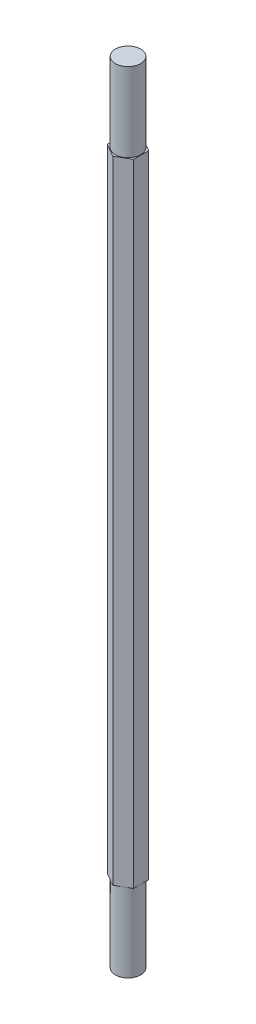
ISO-10303-21;
HEADER;
FILE_DESCRIPTION(('STEP AP214'),'2;1');
FILE_NAME('part.step','',(''),(''),'','','');
FILE_SCHEMA(('AUTOMOTIVE_DESIGN { 1 0 10303 214 1 1 1 1 }'));
ENDSEC;
DATA;
#1=APPLICATION_CONTEXT('core data for automotive mechanical design processes');
#2=APPLICATION_PROTOCOL_DEFINITION('international standard','automotive_design',2000,#1);
#3=PRODUCT_CONTEXT('',#1,'mechanical');
#4=PRODUCT('Part','Part','',(#3));
#5=PRODUCT_RELATED_PRODUCT_CATEGORY('part','',(#4));
#6=PRODUCT_DEFINITION_FORMATION('','',#4);
#7=PRODUCT_DEFINITION_CONTEXT('part definition',#1,'design');
#8=PRODUCT_DEFINITION('design','',#6,#7);
#9=PRODUCT_DEFINITION_SHAPE('','',#8);
#10=(LENGTH_UNIT() NAMED_UNIT(*) SI_UNIT(.MILLI.,.METRE.));
#11=(NAMED_UNIT(*) PLANE_ANGLE_UNIT() SI_UNIT($,.RADIAN.));
#12=(NAMED_UNIT(*) SI_UNIT($,.STERADIAN.) SOLID_ANGLE_UNIT());
#13=UNCERTAINTY_MEASURE_WITH_UNIT(LENGTH_MEASURE(1.E-05),#10,'distance_accuracy_value','');
#14=(GEOMETRIC_REPRESENTATION_CONTEXT(3) GLOBAL_UNCERTAINTY_ASSIGNED_CONTEXT((#13)) GLOBAL_UNIT_ASSIGNED_CONTEXT((#10,
#11,#12)) REPRESENTATION_CONTEXT('',''));
#15=CARTESIAN_POINT('',(0.,0.,0.));
#16=DIRECTION('',(0.,0.,1.));
#17=DIRECTION('',(1.,0.,0.));
#18=AXIS2_PLACEMENT_3D('',#15,#16,#17);
#19=CARTESIAN_POINT('',(0.14076501932061,190.5,-1.06306101828332));
#20=DIRECTION('',(0.499122205111676,0.,0.86653160609666));
#21=DIRECTION('',(0.86653160609666,0.,-0.499122205111676));
#22=AXIS2_PLACEMENT_3D('',#19,#20,#21);
#23=PLANE('',#22);
#24=DIRECTION('',(0.86653160609666,0.,-0.499122205111676));
#25=VECTOR('',#24,1.);
#26=CARTESIAN_POINT('',(0.14076501932061,19.05,-1.06306101828332));
#27=LINE('',#26,#25);
#28=CARTESIAN_POINT('',(-3.02866098313853,19.05,0.762528359133148));
#29=VERTEX_POINT('',#28);
#30=CARTESIAN_POINT('',(0.14076501932061,19.05,-1.06306101828332));
#31=VERTEX_POINT('',#30);
#32=EDGE_CURVE('E48',#29,#31,#27,.T.);
#33=ORIENTED_EDGE('',*,*,#32,.F.);
#34=DIRECTION('',(0.,-1.,0.));
#35=VECTOR('',#34,1.);
#36=CARTESIAN_POINT('',(-3.02866098313853,190.5,0.762528359133148));
#37=LINE('',#36,#35);
#38=CARTESIAN_POINT('',(-3.02866098313853,171.45,0.762528359133148));
#39=VERTEX_POINT('',#38);
#40=EDGE_CURVE('E115',#39,#29,#37,.T.);
#41=ORIENTED_EDGE('',*,*,#40,.F.);
#42=DIRECTION('',(-0.86653160609666,0.,0.499122205111676));
#43=VECTOR('',#42,1.);
#44=CARTESIAN_POINT('',(0.14076501932061,171.45,-1.06306101828332));
#45=LINE('',#44,#43);
#46=CARTESIAN_POINT('',(0.14076501932061,171.45,-1.06306101828332));
#47=VERTEX_POINT('',#46);
#48=EDGE_CURVE('E106',#47,#39,#45,.T.);
#49=ORIENTED_EDGE('',*,*,#48,.F.);
#50=DIRECTION('',(0.,-1.,0.));
#51=VECTOR('',#50,1.);
#52=CARTESIAN_POINT('',(0.14076501932061,190.5,-1.06306101828332));
#53=LINE('',#52,#51);
#54=EDGE_CURVE('E102',#47,#31,#53,.T.);
#55=ORIENTED_EDGE('',*,*,#54,.T.);
#56=EDGE_LOOP('',(#33,#41,#49,#55));
#57=FACE_BOUND('',#56,.T.);
#58=ADVANCED_FACE('F35',(#57),#23,.F.);
#59=CARTESIAN_POINT('',(-3.02866098313853,190.5,0.762528359133148));
#60=DIRECTION('',(1.,0.,0.));
#61=DIRECTION('',(0.,0.,-1.));
#62=AXIS2_PLACEMENT_3D('',#59,#60,#61);
#63=PLANE('',#62);
#64=DIRECTION('',(0.,0.,-1.));
#65=VECTOR('',#64,1.);
#66=CARTESIAN_POINT('',(-3.02866098313853,19.05,0.762528359133148));
#67=LINE('',#66,#65);
#68=CARTESIAN_POINT('',(-3.02866098313853,19.05,4.42012835913315));
#69=VERTEX_POINT('',#68);
#70=EDGE_CURVE('E137',#69,#29,#67,.T.);
#71=ORIENTED_EDGE('',*,*,#70,.F.);
#72=DIRECTION('',(0.,-1.,0.));
#73=VECTOR('',#72,1.);
#74=CARTESIAN_POINT('',(-3.02866098313853,190.5,4.42012835913315));
#75=LINE('',#74,#73);
#76=CARTESIAN_POINT('',(-3.02866098313853,171.45,4.42012835913315));
#77=VERTEX_POINT('',#76);
#78=EDGE_CURVE('E112',#77,#69,#75,.T.);
#79=ORIENTED_EDGE('',*,*,#78,.F.);
#80=DIRECTION('',(0.,0.,1.));
#81=VECTOR('',#80,1.);
#82=CARTESIAN_POINT('',(-3.02866098313853,171.45,0.762528359133148));
#83=LINE('',#82,#81);
#84=EDGE_CURVE('E122',#39,#77,#83,.T.);
#85=ORIENTED_EDGE('',*,*,#84,.F.);
#86=ORIENTED_EDGE('',*,*,#40,.T.);
#87=EDGE_LOOP('',(#71,#79,#85,#86));
#88=FACE_BOUND('',#87,.T.);
#89=ADVANCED_FACE('F163',(#88),#63,.F.);
#90=CARTESIAN_POINT('',(-3.02866098313853,190.5,4.42012835913315));
#91=DIRECTION('',(0.499122205111677,0.,-0.86653160609666));
#92=DIRECTION('',(-0.86653160609666,0.,-0.499122205111677));
#93=AXIS2_PLACEMENT_3D('',#90,#91,#92);
#94=PLANE('',#93);
#95=DIRECTION('',(-0.86653160609666,0.,-0.499122205111677));
#96=VECTOR('',#95,1.);
#97=CARTESIAN_POINT('',(-3.02866098313853,19.05,4.42012835913315));
#98=LINE('',#97,#96);
#99=CARTESIAN_POINT('',(0.140765019320611,19.05,6.24571773654962));
#100=VERTEX_POINT('',#99);
#101=EDGE_CURVE('E139',#100,#69,#98,.T.);
#102=ORIENTED_EDGE('',*,*,#101,.F.);
#103=DIRECTION('',(0.,-1.,0.));
#104=VECTOR('',#103,1.);
#105=CARTESIAN_POINT('',(0.140765019320611,190.5,6.24571773654962));
#106=LINE('',#105,#104);
#107=CARTESIAN_POINT('',(0.140765019320611,171.45,6.24571773654962));
#108=VERTEX_POINT('',#107);
#109=EDGE_CURVE('E104',#108,#100,#106,.T.);
#110=ORIENTED_EDGE('',*,*,#109,.F.);
#111=DIRECTION('',(0.86653160609666,0.,0.499122205111677));
#112=VECTOR('',#111,1.);
#113=CARTESIAN_POINT('',(-3.02866098313853,171.45,4.42012835913315));
#114=LINE('',#113,#112);
#115=EDGE_CURVE('E123',#77,#108,#114,.T.);
#116=ORIENTED_EDGE('',*,*,#115,.F.);
#117=ORIENTED_EDGE('',*,*,#78,.T.);
#118=EDGE_LOOP('',(#102,#110,#116,#117));
#119=FACE_BOUND('',#118,.T.);
#120=ADVANCED_FACE('F167',(#119),#94,.F.);
#121=CARTESIAN_POINT('',(0.140765019320611,190.5,6.24571773654962));
#122=DIRECTION('',(-0.499122205111677,0.,-0.86653160609666));
#123=DIRECTION('',(-0.86653160609666,0.,0.499122205111677));
#124=AXIS2_PLACEMENT_3D('',#121,#122,#123);
#125=PLANE('',#124);
#126=DIRECTION('',(-0.86653160609666,0.,0.499122205111677));
#127=VECTOR('',#126,1.);
#128=CARTESIAN_POINT('',(0.140765019320611,19.05,6.24571773654962));
#129=LINE('',#128,#127);
#130=CARTESIAN_POINT('',(3.31019102177975,19.05,4.42012835913315));
#131=VERTEX_POINT('',#130);
#132=EDGE_CURVE('E98',#131,#100,#129,.T.);
#133=ORIENTED_EDGE('',*,*,#132,.F.);
#134=DIRECTION('',(0.,-1.,0.));
#135=VECTOR('',#134,1.);
#136=CARTESIAN_POINT('',(3.31019102177975,190.5,4.42012835913315));
#137=LINE('',#136,#135);
#138=CARTESIAN_POINT('',(3.31019102177975,171.45,4.42012835913315));
#139=VERTEX_POINT('',#138);
#140=EDGE_CURVE('E97',#139,#131,#137,.T.);
#141=ORIENTED_EDGE('',*,*,#140,.F.);
#142=DIRECTION('',(0.86653160609666,0.,-0.499122205111677));
#143=VECTOR('',#142,1.);
#144=CARTESIAN_POINT('',(0.140765019320611,171.45,6.24571773654962));
#145=LINE('',#144,#143);
#146=EDGE_CURVE('E127',#108,#139,#145,.T.);
#147=ORIENTED_EDGE('',*,*,#146,.F.);
#148=ORIENTED_EDGE('',*,*,#109,.T.);
#149=EDGE_LOOP('',(#133,#141,#147,#148));
#150=FACE_BOUND('',#149,.T.);
#151=ADVANCED_FACE('F172',(#150),#125,.F.);
#152=CARTESIAN_POINT('',(3.31019102177975,190.5,4.42012835913315));
#153=DIRECTION('',(-1.,0.,0.));
#154=DIRECTION('',(0.,0.,1.));
#155=AXIS2_PLACEMENT_3D('',#152,#153,#154);
#156=PLANE('',#155);
#157=DIRECTION('',(0.,0.,1.));
#158=VECTOR('',#157,1.);
#159=CARTESIAN_POINT('',(3.31019102177975,19.05,4.42012835913315));
#160=LINE('',#159,#158);
#161=CARTESIAN_POINT('',(3.31019102177975,19.05,0.762528359133148));
#162=VERTEX_POINT('',#161);
#163=EDGE_CURVE('E85',#162,#131,#160,.T.);
#164=ORIENTED_EDGE('',*,*,#163,.F.);
#165=DIRECTION('',(0.,-1.,0.));
#166=VECTOR('',#165,1.);
#167=CARTESIAN_POINT('',(3.31019102177975,190.5,0.762528359133148));
#168=LINE('',#167,#166);
#169=CARTESIAN_POINT('',(3.31019102177975,171.45,0.762528359133148));
#170=VERTEX_POINT('',#169);
#171=EDGE_CURVE('E95',#170,#162,#168,.T.);
#172=ORIENTED_EDGE('',*,*,#171,.F.);
#173=DIRECTION('',(0.,0.,-1.));
#174=VECTOR('',#173,1.);
#175=CARTESIAN_POINT('',(3.31019102177975,171.45,4.42012835913315));
#176=LINE('',#175,#174);
#177=EDGE_CURVE('E56',#139,#170,#176,.T.);
#178=ORIENTED_EDGE('',*,*,#177,.F.);
#179=ORIENTED_EDGE('',*,*,#140,.T.);
#180=EDGE_LOOP('',(#164,#172,#178,#179));
#181=FACE_BOUND('',#180,.T.);
#182=ADVANCED_FACE('F94',(#181),#156,.F.);
#183=CARTESIAN_POINT('',(3.31019102177975,190.5,0.762528359133148));
#184=DIRECTION('',(-0.499122205111676,0.,0.86653160609666));
#185=DIRECTION('',(0.86653160609666,0.,0.499122205111676));
#186=AXIS2_PLACEMENT_3D('',#183,#184,#185);
#187=PLANE('',#186);
#188=DIRECTION('',(0.86653160609666,0.,0.499122205111676));
#189=VECTOR('',#188,1.);
#190=CARTESIAN_POINT('',(3.31019102177975,19.05,0.762528359133148));
#191=LINE('',#190,#189);
#192=EDGE_CURVE('E12',#31,#162,#191,.T.);
#193=ORIENTED_EDGE('',*,*,#192,.F.);
#194=ORIENTED_EDGE('',*,*,#54,.F.);
#195=DIRECTION('',(-0.86653160609666,0.,-0.499122205111676));
#196=VECTOR('',#195,1.);
#197=CARTESIAN_POINT('',(3.31019102177975,171.45,0.762528359133148));
#198=LINE('',#197,#196);
#199=EDGE_CURVE('E42',#170,#47,#198,.T.);
#200=ORIENTED_EDGE('',*,*,#199,.F.);
#201=ORIENTED_EDGE('',*,*,#171,.T.);
#202=EDGE_LOOP('',(#193,#194,#200,#201));
#203=FACE_BOUND('',#202,.T.);
#204=ADVANCED_FACE('F101',(#203),#187,.F.);
#205=CARTESIAN_POINT('',(0.14076501932061,171.45,2.59132835913315));
#206=DIRECTION('',(0.,1.,0.));
#207=DIRECTION('',(0.,0.,1.));
#208=AXIS2_PLACEMENT_3D('',#205,#206,#207);
#209=PLANE('',#208);
#210=CARTESIAN_POINT('',(0.146339016861466,171.45,2.59132835913315));
#211=DIRECTION('',(0.,1.,0.));
#212=DIRECTION('',(0.,0.,1.));
#213=AXIS2_PLACEMENT_3D('',#210,#211,#212);
#214=CIRCLE('',#213,3.048);
#215=CARTESIAN_POINT('',(0.146339016861466,171.45,5.63932835913315));
#216=VERTEX_POINT('',#215);
#217=EDGE_CURVE('E130',#216,#216,#214,.T.);
#218=ORIENTED_EDGE('',*,*,#217,.F.);
#219=EDGE_LOOP('',(#218));
#220=FACE_BOUND('',#219,.T.);
#221=ORIENTED_EDGE('',*,*,#48,.T.);
#222=ORIENTED_EDGE('',*,*,#84,.T.);
#223=ORIENTED_EDGE('',*,*,#115,.T.);
#224=ORIENTED_EDGE('',*,*,#146,.T.);
#225=ORIENTED_EDGE('',*,*,#177,.T.);
#226=ORIENTED_EDGE('',*,*,#199,.T.);
#227=EDGE_LOOP('',(#221,#222,#223,#224,#225,#226));
#228=FACE_BOUND('',#227,.T.);
#229=ADVANCED_FACE('F118',(#220,#228),#209,.T.);
#230=CARTESIAN_POINT('',(0.146339016861466,171.45,2.59132835913315));
#231=DIRECTION('',(0.,1.,0.));
#232=DIRECTION('',(0.,0.,1.));
#233=AXIS2_PLACEMENT_3D('',#230,#231,#232);
#234=CYLINDRICAL_SURFACE('',#233,3.048);
#235=CARTESIAN_POINT('',(0.146339016861466,190.5,2.59132835913315));
#236=DIRECTION('',(0.,1.,0.));
#237=DIRECTION('',(0.,0.,1.));
#238=AXIS2_PLACEMENT_3D('',#235,#236,#237);
#239=CIRCLE('',#238,3.048);
#240=CARTESIAN_POINT('',(0.146339016861466,190.5,5.63932835913315));
#241=VERTEX_POINT('',#240);
#242=EDGE_CURVE('E131',#241,#241,#239,.T.);
#243=CARTESIAN_POINT('',(0.146339016861466,171.45,5.63932835913315));
#244=CARTESIAN_POINT('',(0.146339016861466,171.6484375,5.63932835913315));
#245=CARTESIAN_POINT('',(0.146339016861466,171.846875,5.63932835913315));
#246=CARTESIAN_POINT('',(0.146339016861466,172.24375,5.63932835913315));
#247=CARTESIAN_POINT('',(0.146339016861466,172.4421875,5.63932835913315));
#248=CARTESIAN_POINT('',(0.146339016861466,172.8390625,5.63932835913315));
#249=CARTESIAN_POINT('',(0.146339016861466,173.0375,5.63932835913315));
#250=CARTESIAN_POINT('',(0.146339016861466,173.434375,5.63932835913315));
#251=CARTESIAN_POINT('',(0.146339016861466,173.6328125,5.63932835913315));
#252=CARTESIAN_POINT('',(0.146339016861466,174.0296875,5.63932835913315));
#253=CARTESIAN_POINT('',(0.146339016861466,174.228125,5.63932835913315));
#254=CARTESIAN_POINT('',(0.146339016861466,174.625,5.63932835913315));
#255=CARTESIAN_POINT('',(0.146339016861466,174.8234375,5.63932835913315));
#256=CARTESIAN_POINT('',(0.146339016861466,175.2203125,5.63932835913315));
#257=CARTESIAN_POINT('',(0.146339016861466,175.41875,5.63932835913315));
#258=CARTESIAN_POINT('',(0.146339016861466,175.815625,5.63932835913315));
#259=CARTESIAN_POINT('',(0.146339016861466,176.0140625,5.63932835913315));
#260=CARTESIAN_POINT('',(0.146339016861466,176.4109375,5.63932835913315));
#261=CARTESIAN_POINT('',(0.146339016861466,176.609375,5.63932835913315));
#262=CARTESIAN_POINT('',(0.146339016861466,177.00625,5.63932835913315));
#263=CARTESIAN_POINT('',(0.146339016861466,177.2046875,5.63932835913315));
#264=CARTESIAN_POINT('',(0.146339016861466,177.6015625,5.63932835913315));
#265=CARTESIAN_POINT('',(0.146339016861466,177.8,5.63932835913315));
#266=CARTESIAN_POINT('',(0.146339016861466,178.196875,5.63932835913315));
#267=CARTESIAN_POINT('',(0.146339016861466,178.3953125,5.63932835913315));
#268=CARTESIAN_POINT('',(0.146339016861466,178.7921875,5.63932835913315));
#269=CARTESIAN_POINT('',(0.146339016861466,178.990625,5.63932835913315));
#270=CARTESIAN_POINT('',(0.146339016861466,179.3875,5.63932835913315));
#271=CARTESIAN_POINT('',(0.146339016861466,179.5859375,5.63932835913315));
#272=CARTESIAN_POINT('',(0.146339016861466,179.9828125,5.63932835913315));
#273=CARTESIAN_POINT('',(0.146339016861466,180.18125,5.63932835913315));
#274=CARTESIAN_POINT('',(0.146339016861466,180.578125,5.63932835913315));
#275=CARTESIAN_POINT('',(0.146339016861466,180.7765625,5.63932835913315));
#276=CARTESIAN_POINT('',(0.146339016861466,181.1734375,5.63932835913315));
#277=CARTESIAN_POINT('',(0.146339016861466,181.371875,5.63932835913315));
#278=CARTESIAN_POINT('',(0.146339016861466,181.76875,5.63932835913315));
#279=CARTESIAN_POINT('',(0.146339016861466,181.9671875,5.63932835913315));
#280=CARTESIAN_POINT('',(0.146339016861466,182.3640625,5.63932835913315));
#281=CARTESIAN_POINT('',(0.146339016861466,182.5625,5.63932835913315));
#282=CARTESIAN_POINT('',(0.146339016861466,182.959375,5.63932835913315));
#283=CARTESIAN_POINT('',(0.146339016861466,183.1578125,5.63932835913315));
#284=CARTESIAN_POINT('',(0.146339016861466,183.5546875,5.63932835913315));
#285=CARTESIAN_POINT('',(0.146339016861466,183.753125,5.63932835913315));
#286=CARTESIAN_POINT('',(0.146339016861466,184.15,5.63932835913315));
#287=CARTESIAN_POINT('',(0.146339016861466,184.3484375,5.63932835913315));
#288=CARTESIAN_POINT('',(0.146339016861466,184.7453125,5.63932835913315));
#289=CARTESIAN_POINT('',(0.146339016861466,184.94375,5.63932835913315));
#290=CARTESIAN_POINT('',(0.146339016861466,185.340625,5.63932835913315));
#291=CARTESIAN_POINT('',(0.146339016861466,185.5390625,5.63932835913315));
#292=CARTESIAN_POINT('',(0.146339016861466,185.9359375,5.63932835913315));
#293=CARTESIAN_POINT('',(0.146339016861466,186.134375,5.63932835913315));
#294=CARTESIAN_POINT('',(0.146339016861466,186.53125,5.63932835913315));
#295=CARTESIAN_POINT('',(0.146339016861466,186.7296875,5.63932835913315));
#296=CARTESIAN_POINT('',(0.146339016861466,187.1265625,5.63932835913315));
#297=CARTESIAN_POINT('',(0.146339016861466,187.325,5.63932835913315));
#298=CARTESIAN_POINT('',(0.146339016861466,187.721875,5.63932835913315));
#299=CARTESIAN_POINT('',(0.146339016861466,187.9203125,5.63932835913315));
#300=CARTESIAN_POINT('',(0.146339016861466,188.3171875,5.63932835913315));
#301=CARTESIAN_POINT('',(0.146339016861466,188.515625,5.63932835913315));
#302=CARTESIAN_POINT('',(0.146339016861466,188.9125,5.63932835913315));
#303=CARTESIAN_POINT('',(0.146339016861466,189.1109375,5.63932835913315));
#304=CARTESIAN_POINT('',(0.146339016861466,189.5078125,5.63932835913315));
#305=CARTESIAN_POINT('',(0.146339016861466,189.70625,5.63932835913315));
#306=CARTESIAN_POINT('',(0.146339016861466,190.103125,5.63932835913315));
#307=CARTESIAN_POINT('',(0.146339016861466,190.3015625,5.63932835913315));
#308=CARTESIAN_POINT('',(0.146339016861466,190.5,5.63932835913315));
#309=B_SPLINE_CURVE_WITH_KNOTS('',3,(#243,#244,#245,#246,#247,#248,#249,#250,#251,#252,#253,
#254,#255,#256,#257,#258,#259,#260,#261,#262,#263,#264,#265,#266,#267,#268,#269,#270,#271,#272,
#273,#274,#275,#276,#277,#278,#279,#280,#281,#282,#283,#284,#285,#286,#287,#288,#289,#290,#291,
#292,#293,#294,#295,#296,#297,#298,#299,#300,#301,#302,#303,#304,#305,#306,#307,#308),
.UNSPECIFIED.,.F.,.F.,(4,2,2,2,2,2,2,2,2,2,2,2,2,2,2,2,2,2,2,2,2,2,2,2,2,2,2,2,2,2,2,2,4),(0.,
0.5953125,1.190625,1.7859375,2.38125,2.9765625,3.571875,4.1671875,4.7625,5.3578125,5.953125,
6.5484375,7.14375,7.7390625,8.334375,8.92968750000001,9.52500000000001,10.1203125,10.715625,
11.3109375,11.90625,12.5015625,13.096875,13.6921875,14.2875,14.8828125,15.478125,16.0734375,
16.66875,17.2640625,17.859375,18.4546875,19.05),.UNSPECIFIED.);
#310=EDGE_CURVE('BSEAM185',#216,#241,#309,.T.);
#311=ORIENTED_EDGE('',*,*,#217,.T.);
#312=ORIENTED_EDGE('',*,*,#242,.F.);
#313=ORIENTED_EDGE('',*,*,#310,.T.);
#314=ORIENTED_EDGE('',*,*,#310,.F.);
#315=EDGE_LOOP('',(#311,#313,#312,#314));
#316=FACE_BOUND('',#315,.T.);
#317=ADVANCED_FACE('F185',(#316),#234,.T.);
#318=CARTESIAN_POINT('',(-3.02866098313853,190.5,0.762528359133148));
#319=DIRECTION('',(0.,1.,0.));
#320=DIRECTION('',(0.,0.,1.));
#321=AXIS2_PLACEMENT_3D('',#318,#319,#320);
#322=PLANE('',#321);
#323=ORIENTED_EDGE('',*,*,#242,.T.);
#324=EDGE_LOOP('',(#323));
#325=FACE_BOUND('',#324,.T.);
#326=ADVANCED_FACE('F191',(#325),#322,.T.);
#327=CARTESIAN_POINT('',(0.14076501932061,19.05,2.59132835913315));
#328=DIRECTION('',(0.,-1.,0.));
#329=DIRECTION('',(0.,0.,-1.));
#330=AXIS2_PLACEMENT_3D('',#327,#328,#329);
#331=PLANE('',#330);
#332=CARTESIAN_POINT('',(0.146339016861466,19.05,2.59132835913315));
#333=DIRECTION('',(0.,1.,0.));
#334=DIRECTION('',(0.,0.,1.));
#335=AXIS2_PLACEMENT_3D('',#332,#333,#334);
#336=CIRCLE('',#335,3.048);
#337=CARTESIAN_POINT('',(0.146339016861466,19.05,-0.456671640866852));
#338=VERTEX_POINT('',#337);
#339=EDGE_CURVE('E99',#338,#338,#336,.T.);
#340=ORIENTED_EDGE('',*,*,#339,.T.);
#341=EDGE_LOOP('',(#340));
#342=FACE_BOUND('',#341,.T.);
#343=ORIENTED_EDGE('',*,*,#32,.T.);
#344=ORIENTED_EDGE('',*,*,#192,.T.);
#345=ORIENTED_EDGE('',*,*,#163,.T.);
#346=ORIENTED_EDGE('',*,*,#132,.T.);
#347=ORIENTED_EDGE('',*,*,#101,.T.);
#348=ORIENTED_EDGE('',*,*,#70,.T.);
#349=EDGE_LOOP('',(#343,#344,#345,#346,#347,#348));
#350=FACE_BOUND('',#349,.T.);
#351=ADVANCED_FACE('F84',(#342,#350),#331,.T.);
#352=CARTESIAN_POINT('',(0.146339016861466,19.05,2.59132835913315));
#353=DIRECTION('',(0.,-1.,0.));
#354=DIRECTION('',(0.,0.,-1.));
#355=AXIS2_PLACEMENT_3D('',#352,#353,#354);
#356=CYLINDRICAL_SURFACE('',#355,3.048);
#357=CARTESIAN_POINT('',(0.146339016861466,0.,2.59132835913315));
#358=DIRECTION('',(0.,1.,0.));
#359=DIRECTION('',(0.,0.,1.));
#360=AXIS2_PLACEMENT_3D('',#357,#358,#359);
#361=CIRCLE('',#360,3.048);
#362=CARTESIAN_POINT('',(0.146339016861466,0.,-0.456671640866852));
#363=VERTEX_POINT('',#362);
#364=EDGE_CURVE('E142',#363,#363,#361,.T.);
#365=CARTESIAN_POINT('',(0.146339016861466,19.05,-0.456671640866852));
#366=CARTESIAN_POINT('',(0.146339016861466,18.8515625,-0.456671640866852));
#367=CARTESIAN_POINT('',(0.146339016861466,18.653125,-0.456671640866852));
#368=CARTESIAN_POINT('',(0.146339016861466,18.25625,-0.456671640866852));
#369=CARTESIAN_POINT('',(0.146339016861466,18.0578125,-0.456671640866852));
#370=CARTESIAN_POINT('',(0.146339016861466,17.6609375,-0.456671640866852));
#371=CARTESIAN_POINT('',(0.146339016861466,17.4625,-0.456671640866852));
#372=CARTESIAN_POINT('',(0.146339016861466,17.065625,-0.456671640866852));
#373=CARTESIAN_POINT('',(0.146339016861466,16.8671875,-0.456671640866852));
#374=CARTESIAN_POINT('',(0.146339016861466,16.4703125,-0.456671640866852));
#375=CARTESIAN_POINT('',(0.146339016861466,16.271875,-0.456671640866852));
#376=CARTESIAN_POINT('',(0.146339016861466,15.875,-0.456671640866852));
#377=CARTESIAN_POINT('',(0.146339016861466,15.6765625,-0.456671640866852));
#378=CARTESIAN_POINT('',(0.146339016861466,15.2796875,-0.456671640866852));
#379=CARTESIAN_POINT('',(0.146339016861466,15.08125,-0.456671640866852));
#380=CARTESIAN_POINT('',(0.146339016861466,14.684375,-0.456671640866852));
#381=CARTESIAN_POINT('',(0.146339016861466,14.4859375,-0.456671640866852));
#382=CARTESIAN_POINT('',(0.146339016861466,14.0890625,-0.456671640866852));
#383=CARTESIAN_POINT('',(0.146339016861466,13.890625,-0.456671640866852));
#384=CARTESIAN_POINT('',(0.146339016861466,13.49375,-0.456671640866852));
#385=CARTESIAN_POINT('',(0.146339016861466,13.2953125,-0.456671640866852));
#386=CARTESIAN_POINT('',(0.146339016861466,12.8984375,-0.456671640866852));
#387=CARTESIAN_POINT('',(0.146339016861466,12.7,-0.456671640866852));
#388=CARTESIAN_POINT('',(0.146339016861466,12.303125,-0.456671640866852));
#389=CARTESIAN_POINT('',(0.146339016861466,12.1046875,-0.456671640866852));
#390=CARTESIAN_POINT('',(0.146339016861466,11.7078125,-0.456671640866852));
#391=CARTESIAN_POINT('',(0.146339016861466,11.509375,-0.456671640866852));
#392=CARTESIAN_POINT('',(0.146339016861466,11.1125,-0.456671640866852));
#393=CARTESIAN_POINT('',(0.146339016861466,10.9140625,-0.456671640866852));
#394=CARTESIAN_POINT('',(0.146339016861466,10.5171875,-0.456671640866852));
#395=CARTESIAN_POINT('',(0.146339016861466,10.31875,-0.456671640866852));
#396=CARTESIAN_POINT('',(0.146339016861466,9.921875,-0.456671640866852));
#397=CARTESIAN_POINT('',(0.146339016861466,9.7234375,-0.456671640866852));
#398=CARTESIAN_POINT('',(0.146339016861466,9.3265625,-0.456671640866852));
#399=CARTESIAN_POINT('',(0.146339016861466,9.128125,-0.456671640866852));
#400=CARTESIAN_POINT('',(0.146339016861466,8.73125,-0.456671640866852));
#401=CARTESIAN_POINT('',(0.146339016861466,8.5328125,-0.456671640866852));
#402=CARTESIAN_POINT('',(0.146339016861466,8.1359375,-0.456671640866852));
#403=CARTESIAN_POINT('',(0.146339016861466,7.9375,-0.456671640866852));
#404=CARTESIAN_POINT('',(0.146339016861466,7.540625,-0.456671640866852));
#405=CARTESIAN_POINT('',(0.146339016861466,7.3421875,-0.456671640866852));
#406=CARTESIAN_POINT('',(0.146339016861466,6.9453125,-0.456671640866852));
#407=CARTESIAN_POINT('',(0.146339016861466,6.746875,-0.456671640866852));
#408=CARTESIAN_POINT('',(0.146339016861466,6.35,-0.456671640866852));
#409=CARTESIAN_POINT('',(0.146339016861466,6.1515625,-0.456671640866852));
#410=CARTESIAN_POINT('',(0.146339016861466,5.7546875,-0.456671640866852));
#411=CARTESIAN_POINT('',(0.146339016861466,5.55625,-0.456671640866852));
#412=CARTESIAN_POINT('',(0.146339016861466,5.159375,-0.456671640866852));
#413=CARTESIAN_POINT('',(0.146339016861466,4.9609375,-0.456671640866852));
#414=CARTESIAN_POINT('',(0.146339016861466,4.5640625,-0.456671640866852));
#415=CARTESIAN_POINT('',(0.146339016861466,4.365625,-0.456671640866852));
#416=CARTESIAN_POINT('',(0.146339016861466,3.96875,-0.456671640866852));
#417=CARTESIAN_POINT('',(0.146339016861466,3.7703125,-0.456671640866852));
#418=CARTESIAN_POINT('',(0.146339016861466,3.3734375,-0.456671640866852));
#419=CARTESIAN_POINT('',(0.146339016861466,3.175,-0.456671640866852));
#420=CARTESIAN_POINT('',(0.146339016861466,2.778125,-0.456671640866852));
#421=CARTESIAN_POINT('',(0.146339016861466,2.5796875,-0.456671640866852));
#422=CARTESIAN_POINT('',(0.146339016861466,2.1828125,-0.456671640866852));
#423=CARTESIAN_POINT('',(0.146339016861466,1.984375,-0.456671640866852));
#424=CARTESIAN_POINT('',(0.146339016861466,1.5875,-0.456671640866852));
#425=CARTESIAN_POINT('',(0.146339016861466,1.3890625,-0.456671640866852));
#426=CARTESIAN_POINT('',(0.146339016861466,0.992187500000001,-0.456671640866852));
#427=CARTESIAN_POINT('',(0.146339016861466,0.793750000000001,-0.456671640866852));
#428=CARTESIAN_POINT('',(0.146339016861466,0.396875,-0.456671640866852));
#429=CARTESIAN_POINT('',(0.146339016861466,0.1984375,-0.456671640866852));
#430=CARTESIAN_POINT('',(0.146339016861466,0.,-0.456671640866852));
#431=B_SPLINE_CURVE_WITH_KNOTS('',3,(#365,#366,#367,#368,#369,#370,#371,#372,#373,#374,#375,
#376,#377,#378,#379,#380,#381,#382,#383,#384,#385,#386,#387,#388,#389,#390,#391,#392,#393,#394,
#395,#396,#397,#398,#399,#400,#401,#402,#403,#404,#405,#406,#407,#408,#409,#410,#411,#412,#413,
#414,#415,#416,#417,#418,#419,#420,#421,#422,#423,#424,#425,#426,#427,#428,#429,#430),
.UNSPECIFIED.,.F.,.F.,(4,2,2,2,2,2,2,2,2,2,2,2,2,2,2,2,2,2,2,2,2,2,2,2,2,2,2,2,2,2,2,2,4),(0.,
0.595312499999997,1.190625,1.7859375,2.38125,2.9765625,3.571875,4.1671875,4.7625,5.3578125,
5.953125,6.5484375,7.14375,7.7390625,8.334375,8.9296875,9.525,10.1203125,10.715625,11.3109375,
11.90625,12.5015625,13.096875,13.6921875,14.2875,14.8828125,15.478125,16.0734375,16.66875,
17.2640625,17.859375,18.4546875,19.05),.UNSPECIFIED.);
#432=EDGE_CURVE('BSEAM149',#338,#363,#431,.T.);
#433=ORIENTED_EDGE('',*,*,#339,.F.);
#434=ORIENTED_EDGE('',*,*,#364,.T.);
#435=ORIENTED_EDGE('',*,*,#432,.T.);
#436=ORIENTED_EDGE('',*,*,#432,.F.);
#437=EDGE_LOOP('',(#433,#435,#434,#436));
#438=FACE_BOUND('',#437,.T.);
#439=ADVANCED_FACE('F149',(#438),#356,.T.);
#440=CARTESIAN_POINT('',(-3.02866098313853,0.,0.762528359133148));
#441=DIRECTION('',(0.,1.,0.));
#442=DIRECTION('',(0.,0.,1.));
#443=AXIS2_PLACEMENT_3D('',#440,#441,#442);
#444=PLANE('',#443);
#445=ORIENTED_EDGE('',*,*,#364,.F.);
#446=EDGE_LOOP('',(#445));
#447=FACE_BOUND('',#446,.T.);
#448=ADVANCED_FACE('F152',(#447),#444,.F.);
#449=CLOSED_SHELL('',(#58,#89,#120,#151,#182,#204,#229,#317,#326,#351,#439,#448));
#450=MANIFOLD_SOLID_BREP('B2',#449);
#451=ADVANCED_BREP_SHAPE_REPRESENTATION('',(#18,#450),#14);
#452=SHAPE_DEFINITION_REPRESENTATION(#9,#451);
ENDSEC;
END-ISO-10303-21;
